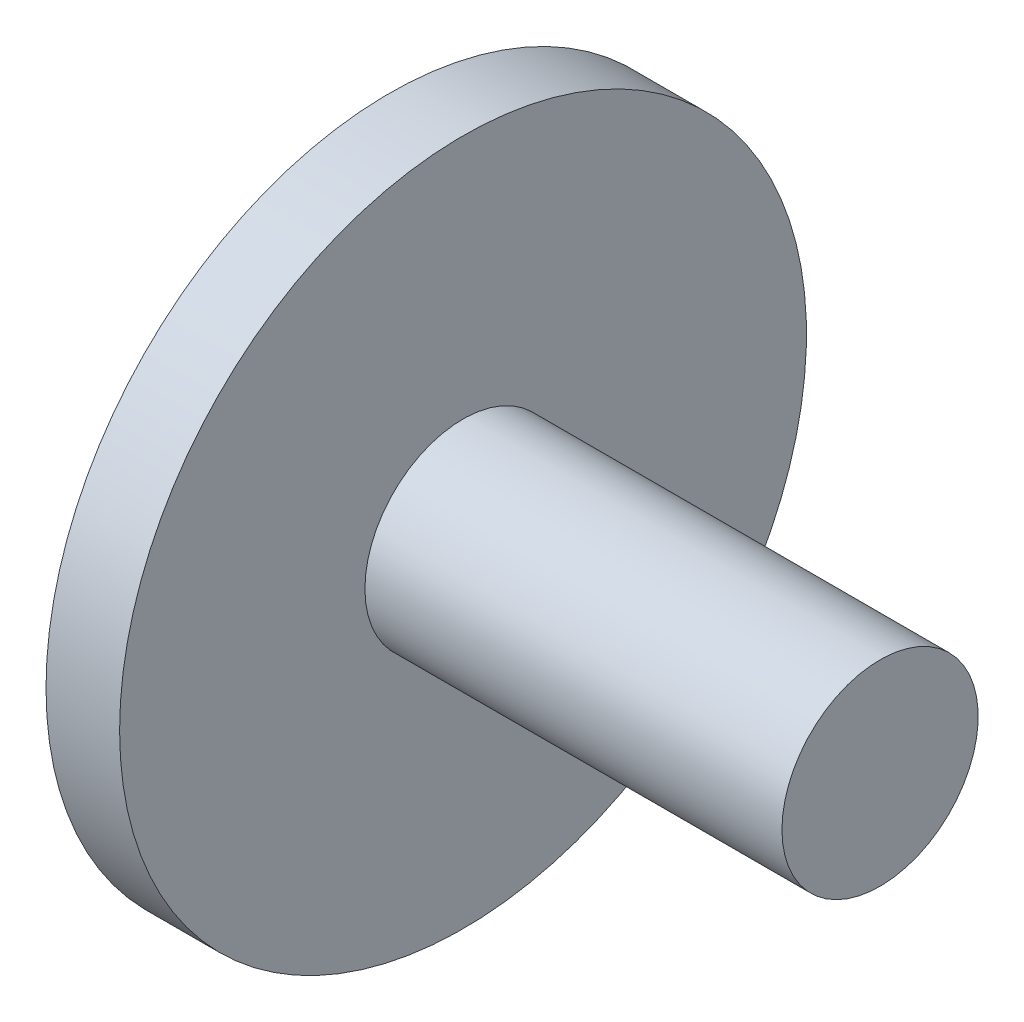
ISO-10303-21;
HEADER;
FILE_DESCRIPTION(('STEP AP214'),'2;1');
FILE_NAME('part.step','',(''),(''),'','','');
FILE_SCHEMA(('AUTOMOTIVE_DESIGN { 1 0 10303 214 1 1 1 1 }'));
ENDSEC;
DATA;
#1=APPLICATION_CONTEXT('core data for automotive mechanical design processes');
#2=APPLICATION_PROTOCOL_DEFINITION('international standard','automotive_design',2000,#1);
#3=PRODUCT_CONTEXT('',#1,'mechanical');
#4=PRODUCT('Part','Part','',(#3));
#5=PRODUCT_RELATED_PRODUCT_CATEGORY('part','',(#4));
#6=PRODUCT_DEFINITION_FORMATION('','',#4);
#7=PRODUCT_DEFINITION_CONTEXT('part definition',#1,'design');
#8=PRODUCT_DEFINITION('design','',#6,#7);
#9=PRODUCT_DEFINITION_SHAPE('','',#8);
#10=(LENGTH_UNIT() NAMED_UNIT(*) SI_UNIT(.MILLI.,.METRE.));
#11=(NAMED_UNIT(*) PLANE_ANGLE_UNIT() SI_UNIT($,.RADIAN.));
#12=(NAMED_UNIT(*) SI_UNIT($,.STERADIAN.) SOLID_ANGLE_UNIT());
#13=UNCERTAINTY_MEASURE_WITH_UNIT(LENGTH_MEASURE(1.E-05),#10,'distance_accuracy_value','');
#14=(GEOMETRIC_REPRESENTATION_CONTEXT(3) GLOBAL_UNCERTAINTY_ASSIGNED_CONTEXT((#13)) GLOBAL_UNIT_ASSIGNED_CONTEXT((#10,
#11,#12)) REPRESENTATION_CONTEXT('',''));
#15=CARTESIAN_POINT('',(0.,0.,0.));
#16=DIRECTION('',(0.,0.,1.));
#17=DIRECTION('',(1.,0.,0.));
#18=AXIS2_PLACEMENT_3D('',#15,#16,#17);
#19=CARTESIAN_POINT('',(-50.15,2.69861313868613,72.1941406768414));
#20=DIRECTION('',(-1.,0.,0.));
#21=DIRECTION('',(0.,0.,1.));
#22=AXIS2_PLACEMENT_3D('',#19,#20,#21);
#23=CYLINDRICAL_SURFACE('',#22,0.200000000000003);
#24=CARTESIAN_POINT('',(-50.15,2.69861313868613,72.1941406768414));
#25=DIRECTION('',(-1.,0.,0.));
#26=DIRECTION('',(0.,0.,1.));
#27=AXIS2_PLACEMENT_3D('',#24,#25,#26);
#28=CIRCLE('',#27,0.200000000000003);
#29=CARTESIAN_POINT('',(-50.15,2.69861313868613,72.3941406768414));
#30=VERTEX_POINT('',#29);
#31=EDGE_CURVE('E10',#30,#30,#28,.T.);
#32=ORIENTED_EDGE('',*,*,#31,.T.);
#33=EDGE_LOOP('',(#32));
#34=FACE_BOUND('',#33,.T.);
#35=CARTESIAN_POINT('',(-51.,2.69861313868613,72.1941406768414));
#36=DIRECTION('',(-1.,0.,0.));
#37=DIRECTION('',(0.,0.,1.));
#38=AXIS2_PLACEMENT_3D('',#35,#36,#37);
#39=CIRCLE('',#38,0.200000000000003);
#40=CARTESIAN_POINT('',(-51.,2.69861313868613,72.3941406768414));
#41=VERTEX_POINT('',#40);
#42=EDGE_CURVE('E41',#41,#41,#39,.F.);
#43=ORIENTED_EDGE('',*,*,#42,.T.);
#44=EDGE_LOOP('',(#43));
#45=FACE_BOUND('',#44,.T.);
#46=ADVANCED_FACE('F38',(#34,#45),#23,.T.);
#47=CARTESIAN_POINT('',(-50.15,2.69861313868613,72.1941406768414));
#48=DIRECTION('',(-1.,0.,0.));
#49=DIRECTION('',(0.,0.,1.));
#50=AXIS2_PLACEMENT_3D('',#47,#48,#49);
#51=PLANE('',#50);
#52=ORIENTED_EDGE('',*,*,#31,.F.);
#53=EDGE_LOOP('',(#52));
#54=FACE_BOUND('',#53,.T.);
#55=ADVANCED_FACE('F69',(#54),#51,.F.);
#56=CARTESIAN_POINT('',(-51.,2.69861313868613,72.1941406768414));
#57=DIRECTION('',(-1.,0.,0.));
#58=DIRECTION('',(0.,0.,1.));
#59=AXIS2_PLACEMENT_3D('',#56,#57,#58);
#60=CYLINDRICAL_SURFACE('',#59,0.699999999999987);
#61=CARTESIAN_POINT('',(-51.,2.69861313868613,72.1941406768414));
#62=DIRECTION('',(-1.,0.,0.));
#63=DIRECTION('',(0.,0.,1.));
#64=AXIS2_PLACEMENT_3D('',#61,#62,#63);
#65=CIRCLE('',#64,0.699999999999987);
#66=CARTESIAN_POINT('',(-51.,2.69861313868613,72.8941406768414));
#67=VERTEX_POINT('',#66);
#68=EDGE_CURVE('E48',#67,#67,#65,.T.);
#69=ORIENTED_EDGE('',*,*,#68,.T.);
#70=EDGE_LOOP('',(#69));
#71=FACE_BOUND('',#70,.T.);
#72=CARTESIAN_POINT('',(-51.15,2.69861313868613,72.1941406768414));
#73=DIRECTION('',(-1.,0.,0.));
#74=DIRECTION('',(0.,0.,1.));
#75=AXIS2_PLACEMENT_3D('',#72,#73,#74);
#76=CIRCLE('',#75,0.699999999999987);
#77=CARTESIAN_POINT('',(-51.15,2.69861313868613,72.8941406768414));
#78=VERTEX_POINT('',#77);
#79=EDGE_CURVE('E50',#78,#78,#76,.T.);
#80=ORIENTED_EDGE('',*,*,#79,.F.);
#81=EDGE_LOOP('',(#80));
#82=FACE_BOUND('',#81,.T.);
#83=ADVANCED_FACE('F56',(#71,#82),#60,.T.);
#84=CARTESIAN_POINT('',(-51.,2.69861313868613,72.1941406768414));
#85=DIRECTION('',(-1.,0.,0.));
#86=DIRECTION('',(0.,0.,1.));
#87=AXIS2_PLACEMENT_3D('',#84,#85,#86);
#88=PLANE('',#87);
#89=ORIENTED_EDGE('',*,*,#42,.F.);
#90=EDGE_LOOP('',(#89));
#91=FACE_BOUND('',#90,.T.);
#92=ORIENTED_EDGE('',*,*,#68,.F.);
#93=EDGE_LOOP('',(#92));
#94=FACE_BOUND('',#93,.T.);
#95=ADVANCED_FACE('F59',(#91,#94),#88,.F.);
#96=CARTESIAN_POINT('',(-51.15,2.69861313868613,72.1941406768414));
#97=DIRECTION('',(-1.,0.,0.));
#98=DIRECTION('',(0.,0.,1.));
#99=AXIS2_PLACEMENT_3D('',#96,#97,#98);
#100=PLANE('',#99);
#101=ORIENTED_EDGE('',*,*,#79,.T.);
#102=EDGE_LOOP('',(#101));
#103=FACE_BOUND('',#102,.T.);
#104=ADVANCED_FACE('F61',(#103),#100,.T.);
#105=CLOSED_SHELL('',(#46,#55,#83,#95,#104));
#106=MANIFOLD_SOLID_BREP('B2',#105);
#107=ADVANCED_BREP_SHAPE_REPRESENTATION('',(#18,#106),#14);
#108=SHAPE_DEFINITION_REPRESENTATION(#9,#107);
ENDSEC;
END-ISO-10303-21;
